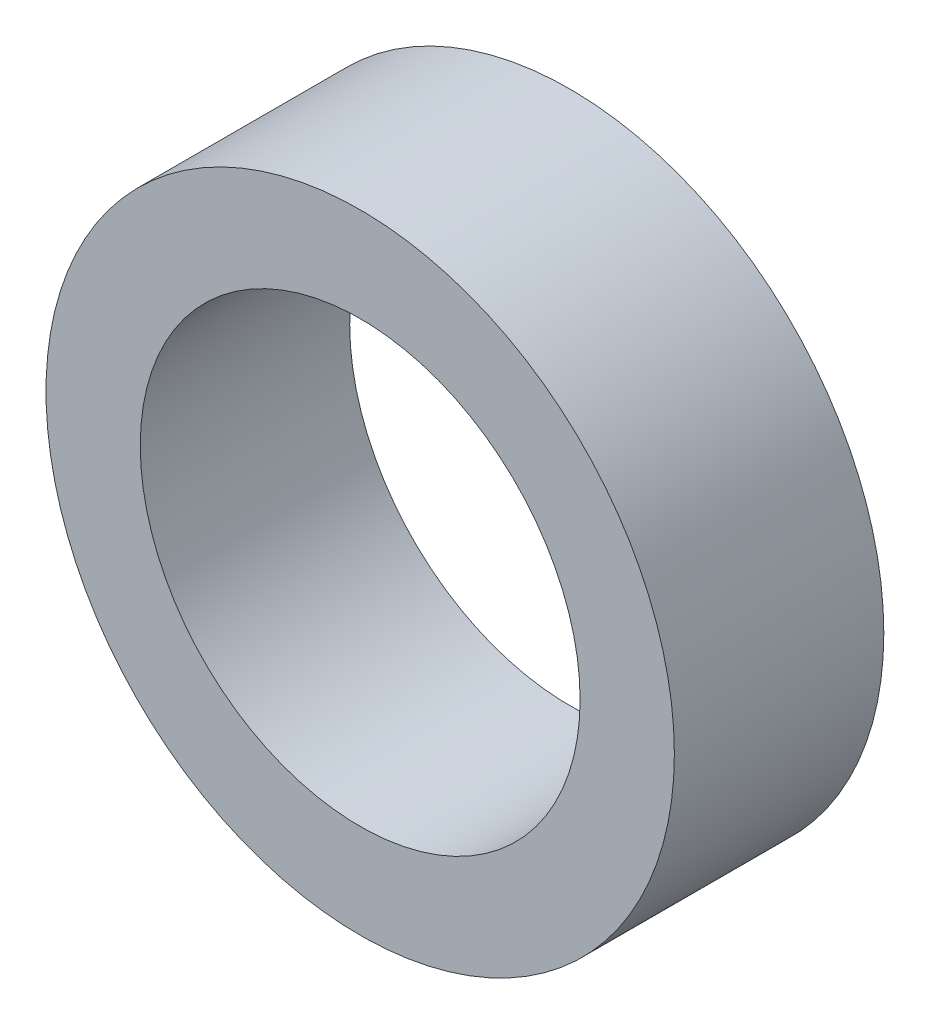
ISO-10303-21;
HEADER;
FILE_DESCRIPTION(('STEP AP214'),'2;1');
FILE_NAME('part.step','',(''),(''),'','','');
FILE_SCHEMA(('AUTOMOTIVE_DESIGN { 1 0 10303 214 1 1 1 1 }'));
ENDSEC;
DATA;
#1=APPLICATION_CONTEXT('core data for automotive mechanical design processes');
#2=APPLICATION_PROTOCOL_DEFINITION('international standard','automotive_design',2000,#1);
#3=PRODUCT_CONTEXT('',#1,'mechanical');
#4=PRODUCT('Part','Part','',(#3));
#5=PRODUCT_RELATED_PRODUCT_CATEGORY('part','',(#4));
#6=PRODUCT_DEFINITION_FORMATION('','',#4);
#7=PRODUCT_DEFINITION_CONTEXT('part definition',#1,'design');
#8=PRODUCT_DEFINITION('design','',#6,#7);
#9=PRODUCT_DEFINITION_SHAPE('','',#8);
#10=(LENGTH_UNIT() NAMED_UNIT(*) SI_UNIT(.MILLI.,.METRE.));
#11=(NAMED_UNIT(*) PLANE_ANGLE_UNIT() SI_UNIT($,.RADIAN.));
#12=(NAMED_UNIT(*) SI_UNIT($,.STERADIAN.) SOLID_ANGLE_UNIT());
#13=UNCERTAINTY_MEASURE_WITH_UNIT(LENGTH_MEASURE(1.E-05),#10,'distance_accuracy_value','');
#14=(GEOMETRIC_REPRESENTATION_CONTEXT(3) GLOBAL_UNCERTAINTY_ASSIGNED_CONTEXT((#13)) GLOBAL_UNIT_ASSIGNED_CONTEXT((#10,
#11,#12)) REPRESENTATION_CONTEXT('',''));
#15=CARTESIAN_POINT('',(0.,0.,0.));
#16=DIRECTION('',(0.,0.,1.));
#17=DIRECTION('',(1.,0.,0.));
#18=AXIS2_PLACEMENT_3D('',#15,#16,#17);
#19=CARTESIAN_POINT('',(0.,0.,5.));
#20=DIRECTION('',(0.,0.,1.));
#21=DIRECTION('',(1.,0.,0.));
#22=AXIS2_PLACEMENT_3D('',#19,#20,#21);
#23=PLANE('',#22);
#24=CARTESIAN_POINT('',(0.,0.,5.));
#25=DIRECTION('',(0.,0.,1.));
#26=DIRECTION('',(1.,0.,0.));
#27=AXIS2_PLACEMENT_3D('',#24,#25,#26);
#28=CIRCLE('',#27,7.5);
#29=CARTESIAN_POINT('',(7.5,0.,5.));
#30=VERTEX_POINT('',#29);
#31=EDGE_CURVE('E10',#30,#30,#28,.T.);
#32=ORIENTED_EDGE('',*,*,#31,.T.);
#33=EDGE_LOOP('',(#32));
#34=FACE_BOUND('',#33,.T.);
#35=CARTESIAN_POINT('',(0.,0.,5.));
#36=DIRECTION('',(0.,0.,1.));
#37=DIRECTION('',(1.,0.,0.));
#38=AXIS2_PLACEMENT_3D('',#35,#36,#37);
#39=CIRCLE('',#38,5.25);
#40=CARTESIAN_POINT('',(5.25,0.,5.));
#41=VERTEX_POINT('',#40);
#42=EDGE_CURVE('E50',#41,#41,#39,.T.);
#43=ORIENTED_EDGE('',*,*,#42,.F.);
#44=EDGE_LOOP('',(#43));
#45=FACE_BOUND('',#44,.T.);
#46=ADVANCED_FACE('F37',(#34,#45),#23,.T.);
#47=CARTESIAN_POINT('',(0.,0.,0.));
#48=DIRECTION('',(0.,0.,1.));
#49=DIRECTION('',(1.,0.,0.));
#50=AXIS2_PLACEMENT_3D('',#47,#48,#49);
#51=PLANE('',#50);
#52=CARTESIAN_POINT('',(0.,0.,0.));
#53=DIRECTION('',(0.,0.,1.));
#54=DIRECTION('',(1.,0.,0.));
#55=AXIS2_PLACEMENT_3D('',#52,#53,#54);
#56=CIRCLE('',#55,7.5);
#57=CARTESIAN_POINT('',(7.5,0.,0.));
#58=VERTEX_POINT('',#57);
#59=EDGE_CURVE('E41',#58,#58,#56,.T.);
#60=ORIENTED_EDGE('',*,*,#59,.F.);
#61=EDGE_LOOP('',(#60));
#62=FACE_BOUND('',#61,.T.);
#63=CARTESIAN_POINT('',(0.,0.,0.));
#64=DIRECTION('',(0.,0.,1.));
#65=DIRECTION('',(1.,0.,0.));
#66=AXIS2_PLACEMENT_3D('',#63,#64,#65);
#67=CIRCLE('',#66,5.25);
#68=CARTESIAN_POINT('',(5.25,0.,0.));
#69=VERTEX_POINT('',#68);
#70=EDGE_CURVE('E52',#69,#69,#67,.T.);
#71=ORIENTED_EDGE('',*,*,#70,.T.);
#72=EDGE_LOOP('',(#71));
#73=FACE_BOUND('',#72,.T.);
#74=ADVANCED_FACE('F64',(#62,#73),#51,.F.);
#75=CARTESIAN_POINT('',(0.,0.,5.));
#76=DIRECTION('',(0.,0.,-1.));
#77=DIRECTION('',(-1.,0.,0.));
#78=AXIS2_PLACEMENT_3D('',#75,#76,#77);
#79=CYLINDRICAL_SURFACE('',#78,7.5);
#80=ORIENTED_EDGE('',*,*,#31,.F.);
#81=EDGE_LOOP('',(#80));
#82=FACE_BOUND('',#81,.T.);
#83=ORIENTED_EDGE('',*,*,#59,.T.);
#84=EDGE_LOOP('',(#83));
#85=FACE_BOUND('',#84,.T.);
#86=ADVANCED_FACE('F39',(#82,#85),#79,.T.);
#87=CARTESIAN_POINT('',(0.,0.,5.));
#88=DIRECTION('',(0.,0.,-1.));
#89=DIRECTION('',(-1.,0.,0.));
#90=AXIS2_PLACEMENT_3D('',#87,#88,#89);
#91=CYLINDRICAL_SURFACE('',#90,5.25);
#92=ORIENTED_EDGE('',*,*,#42,.T.);
#93=EDGE_LOOP('',(#92));
#94=FACE_BOUND('',#93,.T.);
#95=ORIENTED_EDGE('',*,*,#70,.F.);
#96=EDGE_LOOP('',(#95));
#97=FACE_BOUND('',#96,.T.);
#98=ADVANCED_FACE('F60',(#94,#97),#91,.F.);
#99=CLOSED_SHELL('',(#46,#74,#86,#98));
#100=MANIFOLD_SOLID_BREP('B2',#99);
#101=ADVANCED_BREP_SHAPE_REPRESENTATION('',(#18,#100),#14);
#102=SHAPE_DEFINITION_REPRESENTATION(#9,#101);
ENDSEC;
END-ISO-10303-21;
